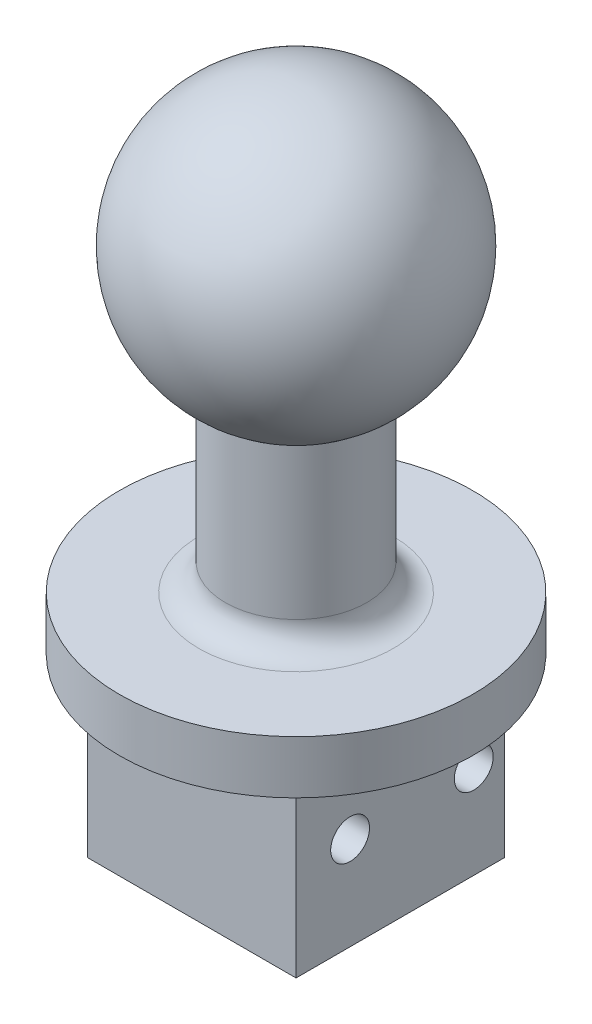
ISO-10303-21;
HEADER;
FILE_DESCRIPTION(('STEP AP214'),'2;1');
FILE_NAME('part.step','',(''),(''),'','','');
FILE_SCHEMA(('AUTOMOTIVE_DESIGN { 1 0 10303 214 1 1 1 1 }'));
ENDSEC;
DATA;
#1=APPLICATION_CONTEXT('core data for automotive mechanical design processes');
#2=APPLICATION_PROTOCOL_DEFINITION('international standard','automotive_design',2000,#1);
#3=PRODUCT_CONTEXT('',#1,'mechanical');
#4=PRODUCT('Part','Part','',(#3));
#5=PRODUCT_RELATED_PRODUCT_CATEGORY('part','',(#4));
#6=PRODUCT_DEFINITION_FORMATION('','',#4);
#7=PRODUCT_DEFINITION_CONTEXT('part definition',#1,'design');
#8=PRODUCT_DEFINITION('design','',#6,#7);
#9=PRODUCT_DEFINITION_SHAPE('','',#8);
#10=(LENGTH_UNIT() NAMED_UNIT(*) SI_UNIT(.MILLI.,.METRE.));
#11=(NAMED_UNIT(*) PLANE_ANGLE_UNIT() SI_UNIT($,.RADIAN.));
#12=(NAMED_UNIT(*) SI_UNIT($,.STERADIAN.) SOLID_ANGLE_UNIT());
#13=UNCERTAINTY_MEASURE_WITH_UNIT(LENGTH_MEASURE(1.E-05),#10,'distance_accuracy_value','');
#14=(GEOMETRIC_REPRESENTATION_CONTEXT(3) GLOBAL_UNCERTAINTY_ASSIGNED_CONTEXT((#13)) GLOBAL_UNIT_ASSIGNED_CONTEXT((#10,
#11,#12)) REPRESENTATION_CONTEXT('',''));
#15=CARTESIAN_POINT('',(0.,0.,0.));
#16=DIRECTION('',(0.,0.,1.));
#17=DIRECTION('',(1.,0.,0.));
#18=AXIS2_PLACEMENT_3D('',#15,#16,#17);
#19=CARTESIAN_POINT('',(5.9,10.,-5.9));
#20=DIRECTION('',(-1.,0.,0.));
#21=DIRECTION('',(0.,0.,1.));
#22=AXIS2_PLACEMENT_3D('',#19,#20,#21);
#23=PLANE('',#22);
#24=CARTESIAN_POINT('',(5.9,5.28,2.84));
#25=DIRECTION('',(1.,0.,0.));
#26=DIRECTION('',(0.,0.,-1.));
#27=AXIS2_PLACEMENT_3D('',#24,#25,#26);
#28=CIRCLE('',#27,1.1);
#29=CARTESIAN_POINT('',(5.9,5.28,1.74));
#30=VERTEX_POINT('',#29);
#31=EDGE_CURVE('E256',#30,#30,#28,.T.);
#32=ORIENTED_EDGE('',*,*,#31,.F.);
#33=EDGE_LOOP('',(#32));
#34=FACE_BOUND('',#33,.T.);
#35=CARTESIAN_POINT('',(5.9,5.28,-4.16));
#36=DIRECTION('',(1.,0.,0.));
#37=DIRECTION('',(0.,0.,-1.));
#38=AXIS2_PLACEMENT_3D('',#35,#36,#37);
#39=CIRCLE('',#38,1.1);
#40=CARTESIAN_POINT('',(5.9,5.28,-5.26));
#41=VERTEX_POINT('',#40);
#42=EDGE_CURVE('E253',#41,#41,#39,.T.);
#43=ORIENTED_EDGE('',*,*,#42,.F.);
#44=EDGE_LOOP('',(#43));
#45=FACE_BOUND('',#44,.T.);
#46=DIRECTION('',(0.,-1.,0.));
#47=VECTOR('',#46,1.);
#48=CARTESIAN_POINT('',(5.9,10.,-5.9));
#49=LINE('',#48,#47);
#50=CARTESIAN_POINT('',(5.9,9.5,-5.9));
#51=VERTEX_POINT('',#50);
#52=CARTESIAN_POINT('',(5.9,0.,-5.9));
#53=VERTEX_POINT('',#52);
#54=EDGE_CURVE('E97',#51,#53,#49,.T.);
#55=ORIENTED_EDGE('',*,*,#54,.F.);
#56=DIRECTION('',(0.,0.,-1.));
#57=VECTOR('',#56,1.);
#58=CARTESIAN_POINT('',(5.9,9.5,5.9));
#59=LINE('',#58,#57);
#60=CARTESIAN_POINT('',(5.9,9.5,5.9));
#61=VERTEX_POINT('',#60);
#62=EDGE_CURVE('E66',#51,#61,#59,.F.);
#63=ORIENTED_EDGE('',*,*,#62,.T.);
#64=DIRECTION('',(0.,-1.,0.));
#65=VECTOR('',#64,1.);
#66=CARTESIAN_POINT('',(5.9,10.,5.9));
#67=LINE('',#66,#65);
#68=CARTESIAN_POINT('',(5.9,0.,5.9));
#69=VERTEX_POINT('',#68);
#70=EDGE_CURVE('E117',#61,#69,#67,.T.);
#71=ORIENTED_EDGE('',*,*,#70,.T.);
#72=DIRECTION('',(0.,0.,-1.));
#73=VECTOR('',#72,1.);
#74=CARTESIAN_POINT('',(5.9,0.,-5.9));
#75=LINE('',#74,#73);
#76=EDGE_CURVE('E113',#69,#53,#75,.T.);
#77=ORIENTED_EDGE('',*,*,#76,.T.);
#78=EDGE_LOOP('',(#55,#63,#71,#77));
#79=FACE_BOUND('',#78,.T.);
#80=ADVANCED_FACE('F43',(#34,#45,#79),#23,.F.);
#81=CARTESIAN_POINT('',(-5.9,10.,-5.9));
#82=DIRECTION('',(0.,0.,1.));
#83=DIRECTION('',(1.,0.,0.));
#84=AXIS2_PLACEMENT_3D('',#81,#82,#83);
#85=PLANE('',#84);
#86=DIRECTION('',(0.,-1.,0.));
#87=VECTOR('',#86,1.);
#88=CARTESIAN_POINT('',(-5.9,10.,-5.9));
#89=LINE('',#88,#87);
#90=CARTESIAN_POINT('',(-5.9,9.5,-5.9));
#91=VERTEX_POINT('',#90);
#92=CARTESIAN_POINT('',(-5.9,0.,-5.9));
#93=VERTEX_POINT('',#92);
#94=EDGE_CURVE('E107',#91,#93,#89,.T.);
#95=ORIENTED_EDGE('',*,*,#94,.F.);
#96=DIRECTION('',(-1.,0.,0.));
#97=VECTOR('',#96,1.);
#98=CARTESIAN_POINT('',(5.9,9.5,-5.9));
#99=LINE('',#98,#97);
#100=EDGE_CURVE('E104',#91,#51,#99,.F.);
#101=ORIENTED_EDGE('',*,*,#100,.T.);
#102=ORIENTED_EDGE('',*,*,#54,.T.);
#103=DIRECTION('',(-1.,0.,0.));
#104=VECTOR('',#103,1.);
#105=CARTESIAN_POINT('',(-5.9,0.,-5.9));
#106=LINE('',#105,#104);
#107=EDGE_CURVE('E101',#53,#93,#106,.T.);
#108=ORIENTED_EDGE('',*,*,#107,.T.);
#109=EDGE_LOOP('',(#95,#101,#102,#108));
#110=FACE_BOUND('',#109,.T.);
#111=ADVANCED_FACE('F100',(#110),#85,.F.);
#112=CARTESIAN_POINT('',(-5.9,10.,-5.9));
#113=DIRECTION('',(1.,0.,0.));
#114=DIRECTION('',(0.,0.,-1.));
#115=AXIS2_PLACEMENT_3D('',#112,#113,#114);
#116=PLANE('',#115);
#117=CARTESIAN_POINT('',(-5.9,5.28,2.84));
#118=DIRECTION('',(1.,0.,0.));
#119=DIRECTION('',(0.,0.,-1.));
#120=AXIS2_PLACEMENT_3D('',#117,#118,#119);
#121=CIRCLE('',#120,1.1);
#122=CARTESIAN_POINT('',(-5.9,5.28,1.74));
#123=VERTEX_POINT('',#122);
#124=EDGE_CURVE('E153',#123,#123,#121,.F.);
#125=ORIENTED_EDGE('',*,*,#124,.F.);
#126=EDGE_LOOP('',(#125));
#127=FACE_BOUND('',#126,.T.);
#128=CARTESIAN_POINT('',(-5.9,5.28,-4.16));
#129=DIRECTION('',(1.,0.,0.));
#130=DIRECTION('',(0.,0.,-1.));
#131=AXIS2_PLACEMENT_3D('',#128,#129,#130);
#132=CIRCLE('',#131,1.1);
#133=CARTESIAN_POINT('',(-5.9,5.28,-5.26));
#134=VERTEX_POINT('',#133);
#135=EDGE_CURVE('E251',#134,#134,#132,.F.);
#136=ORIENTED_EDGE('',*,*,#135,.F.);
#137=EDGE_LOOP('',(#136));
#138=FACE_BOUND('',#137,.T.);
#139=DIRECTION('',(0.,-1.,0.));
#140=VECTOR('',#139,1.);
#141=CARTESIAN_POINT('',(-5.9,10.,5.9));
#142=LINE('',#141,#140);
#143=CARTESIAN_POINT('',(-5.9,9.5,5.9));
#144=VERTEX_POINT('',#143);
#145=CARTESIAN_POINT('',(-5.9,0.,5.9));
#146=VERTEX_POINT('',#145);
#147=EDGE_CURVE('E130',#144,#146,#142,.T.);
#148=ORIENTED_EDGE('',*,*,#147,.F.);
#149=DIRECTION('',(0.,0.,1.));
#150=VECTOR('',#149,1.);
#151=CARTESIAN_POINT('',(-5.9,9.5,-5.9));
#152=LINE('',#151,#150);
#153=EDGE_CURVE('E148',#144,#91,#152,.F.);
#154=ORIENTED_EDGE('',*,*,#153,.T.);
#155=ORIENTED_EDGE('',*,*,#94,.T.);
#156=DIRECTION('',(0.,0.,1.));
#157=VECTOR('',#156,1.);
#158=CARTESIAN_POINT('',(-5.9,0.,-5.9));
#159=LINE('',#158,#157);
#160=EDGE_CURVE('E115',#93,#146,#159,.T.);
#161=ORIENTED_EDGE('',*,*,#160,.T.);
#162=EDGE_LOOP('',(#148,#154,#155,#161));
#163=FACE_BOUND('',#162,.T.);
#164=ADVANCED_FACE('F188',(#127,#138,#163),#116,.F.);
#165=CARTESIAN_POINT('',(-5.9,10.,5.9));
#166=DIRECTION('',(0.,0.,-1.));
#167=DIRECTION('',(-1.,0.,0.));
#168=AXIS2_PLACEMENT_3D('',#165,#166,#167);
#169=PLANE('',#168);
#170=ORIENTED_EDGE('',*,*,#70,.F.);
#171=DIRECTION('',(1.,0.,0.));
#172=VECTOR('',#171,1.);
#173=CARTESIAN_POINT('',(-5.9,9.5,5.9));
#174=LINE('',#173,#172);
#175=EDGE_CURVE('E58',#61,#144,#174,.F.);
#176=ORIENTED_EDGE('',*,*,#175,.T.);
#177=ORIENTED_EDGE('',*,*,#147,.T.);
#178=DIRECTION('',(1.,0.,0.));
#179=VECTOR('',#178,1.);
#180=CARTESIAN_POINT('',(-5.9,0.,5.9));
#181=LINE('',#180,#179);
#182=EDGE_CURVE('E127',#146,#69,#181,.T.);
#183=ORIENTED_EDGE('',*,*,#182,.T.);
#184=EDGE_LOOP('',(#170,#176,#177,#183));
#185=FACE_BOUND('',#184,.T.);
#186=ADVANCED_FACE('F241',(#185),#169,.F.);
#187=CARTESIAN_POINT('',(0.,0.,0.));
#188=DIRECTION('',(0.,1.,0.));
#189=DIRECTION('',(0.,0.,1.));
#190=AXIS2_PLACEMENT_3D('',#187,#188,#189);
#191=PLANE('',#190);
#192=ORIENTED_EDGE('',*,*,#76,.F.);
#193=ORIENTED_EDGE('',*,*,#182,.F.);
#194=ORIENTED_EDGE('',*,*,#160,.F.);
#195=ORIENTED_EDGE('',*,*,#107,.F.);
#196=EDGE_LOOP('',(#192,#193,#194,#195));
#197=FACE_BOUND('',#196,.T.);
#198=ADVANCED_FACE('F111',(#197),#191,.F.);
#199=CARTESIAN_POINT('',(0.,10.,0.));
#200=DIRECTION('',(0.,1.,0.));
#201=DIRECTION('',(0.,0.,1.));
#202=AXIS2_PLACEMENT_3D('',#199,#200,#201);
#203=PLANE('',#202);
#204=DIRECTION('',(0.,0.,-1.));
#205=VECTOR('',#204,1.);
#206=CARTESIAN_POINT('',(6.4,10.,-5.9));
#207=LINE('',#206,#205);
#208=CARTESIAN_POINT('',(6.4,10.,6.4));
#209=VERTEX_POINT('',#208);
#210=CARTESIAN_POINT('',(6.4,10.,-6.4));
#211=VERTEX_POINT('',#210);
#212=EDGE_CURVE('E140',#209,#211,#207,.T.);
#213=ORIENTED_EDGE('',*,*,#212,.T.);
#214=DIRECTION('',(-1.,0.,0.));
#215=VECTOR('',#214,1.);
#216=CARTESIAN_POINT('',(-5.9,10.,-6.4));
#217=LINE('',#216,#215);
#218=CARTESIAN_POINT('',(-6.4,10.,-6.4));
#219=VERTEX_POINT('',#218);
#220=EDGE_CURVE('E142',#211,#219,#217,.T.);
#221=ORIENTED_EDGE('',*,*,#220,.T.);
#222=DIRECTION('',(0.,0.,1.));
#223=VECTOR('',#222,1.);
#224=CARTESIAN_POINT('',(-6.4,10.,5.9));
#225=LINE('',#224,#223);
#226=CARTESIAN_POINT('',(-6.4,10.,6.4));
#227=VERTEX_POINT('',#226);
#228=EDGE_CURVE('E106',#219,#227,#225,.T.);
#229=ORIENTED_EDGE('',*,*,#228,.T.);
#230=DIRECTION('',(1.,0.,0.));
#231=VECTOR('',#230,1.);
#232=CARTESIAN_POINT('',(5.9,10.,6.4));
#233=LINE('',#232,#231);
#234=EDGE_CURVE('E138',#227,#209,#233,.T.);
#235=ORIENTED_EDGE('',*,*,#234,.T.);
#236=EDGE_LOOP('',(#213,#221,#229,#235));
#237=FACE_BOUND('',#236,.T.);
#238=CARTESIAN_POINT('',(0.,10.,0.));
#239=DIRECTION('',(0.,1.,0.));
#240=DIRECTION('',(0.,0.,1.));
#241=AXIS2_PLACEMENT_3D('',#238,#239,#240);
#242=CIRCLE('',#241,10.);
#243=CARTESIAN_POINT('',(0.,10.,10.));
#244=VERTEX_POINT('',#243);
#245=EDGE_CURVE('E122',#244,#244,#242,.T.);
#246=ORIENTED_EDGE('',*,*,#245,.F.);
#247=EDGE_LOOP('',(#246));
#248=FACE_BOUND('',#247,.T.);
#249=ADVANCED_FACE('F221',(#237,#248),#203,.F.);
#250=CARTESIAN_POINT('',(0.,13.,0.));
#251=DIRECTION('',(0.,-1.,0.));
#252=DIRECTION('',(0.,0.,-1.));
#253=AXIS2_PLACEMENT_3D('',#250,#251,#252);
#254=CYLINDRICAL_SURFACE('',#253,10.);
#255=CARTESIAN_POINT('',(0.,13.,0.));
#256=DIRECTION('',(0.,1.,0.));
#257=DIRECTION('',(0.,0.,1.));
#258=AXIS2_PLACEMENT_3D('',#255,#256,#257);
#259=CIRCLE('',#258,10.);
#260=CARTESIAN_POINT('',(0.,13.,10.));
#261=VERTEX_POINT('',#260);
#262=EDGE_CURVE('E119',#261,#261,#259,.T.);
#263=ORIENTED_EDGE('',*,*,#262,.F.);
#264=EDGE_LOOP('',(#263));
#265=FACE_BOUND('',#264,.T.);
#266=ORIENTED_EDGE('',*,*,#245,.T.);
#267=EDGE_LOOP('',(#266));
#268=FACE_BOUND('',#267,.T.);
#269=ADVANCED_FACE('F223',(#265,#268),#254,.T.);
#270=CARTESIAN_POINT('',(0.,13.,0.));
#271=DIRECTION('',(0.,1.,0.));
#272=DIRECTION('',(0.,0.,1.));
#273=AXIS2_PLACEMENT_3D('',#270,#271,#272);
#274=PLANE('',#273);
#275=CARTESIAN_POINT('',(0.,13.,0.));
#276=DIRECTION('',(0.,1.,0.));
#277=DIRECTION('',(0.,0.,1.));
#278=AXIS2_PLACEMENT_3D('',#275,#276,#277);
#279=CIRCLE('',#278,5.5);
#280=CARTESIAN_POINT('',(0.,13.,5.5));
#281=VERTEX_POINT('',#280);
#282=EDGE_CURVE('E11',#281,#281,#279,.F.);
#283=ORIENTED_EDGE('',*,*,#282,.T.);
#284=EDGE_LOOP('',(#283));
#285=FACE_BOUND('',#284,.T.);
#286=ORIENTED_EDGE('',*,*,#262,.T.);
#287=EDGE_LOOP('',(#286));
#288=FACE_BOUND('',#287,.T.);
#289=ADVANCED_FACE('F229',(#285,#288),#274,.T.);
#290=CARTESIAN_POINT('',(0.,28.,0.));
#291=DIRECTION('',(0.,-1.,0.));
#292=DIRECTION('',(0.,0.,-1.));
#293=AXIS2_PLACEMENT_3D('',#290,#291,#292);
#294=CYLINDRICAL_SURFACE('',#293,4.);
#295=CARTESIAN_POINT('',(0.,14.5,0.));
#296=DIRECTION('',(0.,1.,0.));
#297=DIRECTION('',(0.,0.,1.));
#298=AXIS2_PLACEMENT_3D('',#295,#296,#297);
#299=CIRCLE('',#298,4.);
#300=CARTESIAN_POINT('',(0.,14.5,4.));
#301=VERTEX_POINT('',#300);
#302=EDGE_CURVE('E51',#301,#301,#299,.T.);
#303=ORIENTED_EDGE('',*,*,#302,.T.);
#304=EDGE_LOOP('',(#303));
#305=FACE_BOUND('',#304,.T.);
#306=CARTESIAN_POINT('',(0.,23.0717967697245,0.));
#307=DIRECTION('',(0.,1.,0.));
#308=DIRECTION('',(0.,0.,1.));
#309=AXIS2_PLACEMENT_3D('',#306,#307,#308);
#310=CIRCLE('',#309,4.);
#311=CARTESIAN_POINT('',(0.,23.0717967697245,4.));
#312=VERTEX_POINT('',#311);
#313=EDGE_CURVE('E133',#312,#312,#310,.F.);
#314=ORIENTED_EDGE('',*,*,#313,.T.);
#315=EDGE_LOOP('',(#314));
#316=FACE_BOUND('',#315,.T.);
#317=ADVANCED_FACE('F162',(#305,#316),#294,.T.);
#318=CARTESIAN_POINT('',(0.,30.,0.));
#319=DIRECTION('',(0.,-1.,0.));
#320=DIRECTION('',(1.,0.,0.));
#321=AXIS2_PLACEMENT_3D('',#318,#319,#320);
#322=SPHERICAL_SURFACE('',#321,8.);
#323=ORIENTED_EDGE('',*,*,#313,.F.);
#324=EDGE_LOOP('',(#323));
#325=FACE_BOUND('',#324,.T.);
#326=ADVANCED_FACE('F202',(#325),#322,.T.);
#327=CARTESIAN_POINT('',(0.,9.5,6.4));
#328=DIRECTION('',(-1.,0.,0.));
#329=DIRECTION('',(0.,0.,1.));
#330=AXIS2_PLACEMENT_3D('',#327,#328,#329);
#331=CYLINDRICAL_SURFACE('',#330,0.5);
#332=CARTESIAN_POINT('',(-6.4,9.5,6.4));
#333=DIRECTION('',(-0.707106781186548,0.,-0.707106781186547));
#334=DIRECTION('',(0.707106781186547,0.,-0.707106781186548));
#335=AXIS2_PLACEMENT_3D('',#332,#333,#334);
#336=ELLIPSE('',#335,0.707106781186547,0.5);
#337=EDGE_CURVE('E155',#144,#227,#336,.F.);
#338=ORIENTED_EDGE('',*,*,#337,.F.);
#339=ORIENTED_EDGE('',*,*,#175,.F.);
#340=CARTESIAN_POINT('',(6.4,9.5,6.4));
#341=DIRECTION('',(-0.707106781186547,0.,0.707106781186548));
#342=DIRECTION('',(-0.707106781186547,0.,-0.707106781186547));
#343=AXIS2_PLACEMENT_3D('',#340,#341,#342);
#344=ELLIPSE('',#343,0.707106781186548,0.5);
#345=EDGE_CURVE('E136',#209,#61,#344,.T.);
#346=ORIENTED_EDGE('',*,*,#345,.F.);
#347=ORIENTED_EDGE('',*,*,#234,.F.);
#348=EDGE_LOOP('',(#338,#339,#346,#347));
#349=FACE_BOUND('',#348,.T.);
#350=ADVANCED_FACE('F199',(#349),#331,.F.);
#351=CARTESIAN_POINT('',(6.4,9.5,0.));
#352=DIRECTION('',(0.,0.,1.));
#353=DIRECTION('',(1.,0.,0.));
#354=AXIS2_PLACEMENT_3D('',#351,#352,#353);
#355=CYLINDRICAL_SURFACE('',#354,0.5);
#356=ORIENTED_EDGE('',*,*,#345,.T.);
#357=ORIENTED_EDGE('',*,*,#62,.F.);
#358=CARTESIAN_POINT('',(6.4,9.5,-6.4));
#359=DIRECTION('',(0.707106781186547,0.,0.707106781186547));
#360=DIRECTION('',(-0.707106781186547,0.,0.707106781186548));
#361=AXIS2_PLACEMENT_3D('',#358,#359,#360);
#362=ELLIPSE('',#361,0.707106781186547,0.5);
#363=EDGE_CURVE('E152',#211,#51,#362,.T.);
#364=ORIENTED_EDGE('',*,*,#363,.F.);
#365=ORIENTED_EDGE('',*,*,#212,.F.);
#366=EDGE_LOOP('',(#356,#357,#364,#365));
#367=FACE_BOUND('',#366,.T.);
#368=ADVANCED_FACE('F196',(#367),#355,.F.);
#369=CARTESIAN_POINT('',(-6.4,9.5,0.));
#370=DIRECTION('',(0.,0.,-1.));
#371=DIRECTION('',(-1.,0.,0.));
#372=AXIS2_PLACEMENT_3D('',#369,#370,#371);
#373=CYLINDRICAL_SURFACE('',#372,0.5);
#374=ORIENTED_EDGE('',*,*,#337,.T.);
#375=ORIENTED_EDGE('',*,*,#228,.F.);
#376=CARTESIAN_POINT('',(-6.4,9.5,-6.4));
#377=DIRECTION('',(0.707106781186547,0.,-0.707106781186548));
#378=DIRECTION('',(-0.707106781186548,0.,-0.707106781186547));
#379=AXIS2_PLACEMENT_3D('',#376,#377,#378);
#380=ELLIPSE('',#379,0.707106781186548,0.5);
#381=EDGE_CURVE('E150',#91,#219,#380,.F.);
#382=ORIENTED_EDGE('',*,*,#381,.F.);
#383=ORIENTED_EDGE('',*,*,#153,.F.);
#384=EDGE_LOOP('',(#374,#375,#382,#383));
#385=FACE_BOUND('',#384,.T.);
#386=ADVANCED_FACE('F178',(#385),#373,.F.);
#387=CARTESIAN_POINT('',(0.,9.5,-6.4));
#388=DIRECTION('',(1.,0.,0.));
#389=DIRECTION('',(0.,0.,-1.));
#390=AXIS2_PLACEMENT_3D('',#387,#388,#389);
#391=CYLINDRICAL_SURFACE('',#390,0.5);
#392=ORIENTED_EDGE('',*,*,#363,.T.);
#393=ORIENTED_EDGE('',*,*,#100,.F.);
#394=ORIENTED_EDGE('',*,*,#381,.T.);
#395=ORIENTED_EDGE('',*,*,#220,.F.);
#396=EDGE_LOOP('',(#392,#393,#394,#395));
#397=FACE_BOUND('',#396,.T.);
#398=ADVANCED_FACE('F167',(#397),#391,.F.);
#399=CARTESIAN_POINT('',(0.,14.5,0.));
#400=DIRECTION('',(0.,1.,0.));
#401=DIRECTION('',(0.,0.,1.));
#402=AXIS2_PLACEMENT_3D('',#399,#400,#401);
#403=TOROIDAL_SURFACE('',#402,5.5,1.5);
#404=ORIENTED_EDGE('',*,*,#282,.F.);
#405=EDGE_LOOP('',(#404));
#406=FACE_BOUND('',#405,.T.);
#407=ORIENTED_EDGE('',*,*,#302,.F.);
#408=EDGE_LOOP('',(#407));
#409=FACE_BOUND('',#408,.T.);
#410=ADVANCED_FACE('F45',(#406,#409),#403,.F.);
#411=CARTESIAN_POINT('',(-10.001,5.28,-4.16));
#412=DIRECTION('',(1.,0.,0.));
#413=DIRECTION('',(0.,0.,-1.));
#414=AXIS2_PLACEMENT_3D('',#411,#412,#413);
#415=CYLINDRICAL_SURFACE('',#414,1.1);
#416=ORIENTED_EDGE('',*,*,#42,.T.);
#417=EDGE_LOOP('',(#416));
#418=FACE_BOUND('',#417,.T.);
#419=ORIENTED_EDGE('',*,*,#135,.T.);
#420=EDGE_LOOP('',(#419));
#421=FACE_BOUND('',#420,.T.);
#422=ADVANCED_FACE('F166',(#418,#421),#415,.F.);
#423=CARTESIAN_POINT('',(-10.001,5.28,2.84));
#424=DIRECTION('',(1.,0.,0.));
#425=DIRECTION('',(0.,0.,-1.));
#426=AXIS2_PLACEMENT_3D('',#423,#424,#425);
#427=CYLINDRICAL_SURFACE('',#426,1.1);
#428=ORIENTED_EDGE('',*,*,#31,.T.);
#429=EDGE_LOOP('',(#428));
#430=FACE_BOUND('',#429,.T.);
#431=ORIENTED_EDGE('',*,*,#124,.T.);
#432=EDGE_LOOP('',(#431));
#433=FACE_BOUND('',#432,.T.);
#434=ADVANCED_FACE('F174',(#430,#433),#427,.F.);
#435=CLOSED_SHELL('',(#80,#111,#164,#186,#198,#249,#269,#289,#317,#326,#350,#368,#386,#398,#410,
#422,#434));
#436=MANIFOLD_SOLID_BREP('B2',#435);
#437=ADVANCED_BREP_SHAPE_REPRESENTATION('',(#18,#436),#14);
#438=SHAPE_DEFINITION_REPRESENTATION(#9,#437);
ENDSEC;
END-ISO-10303-21;
